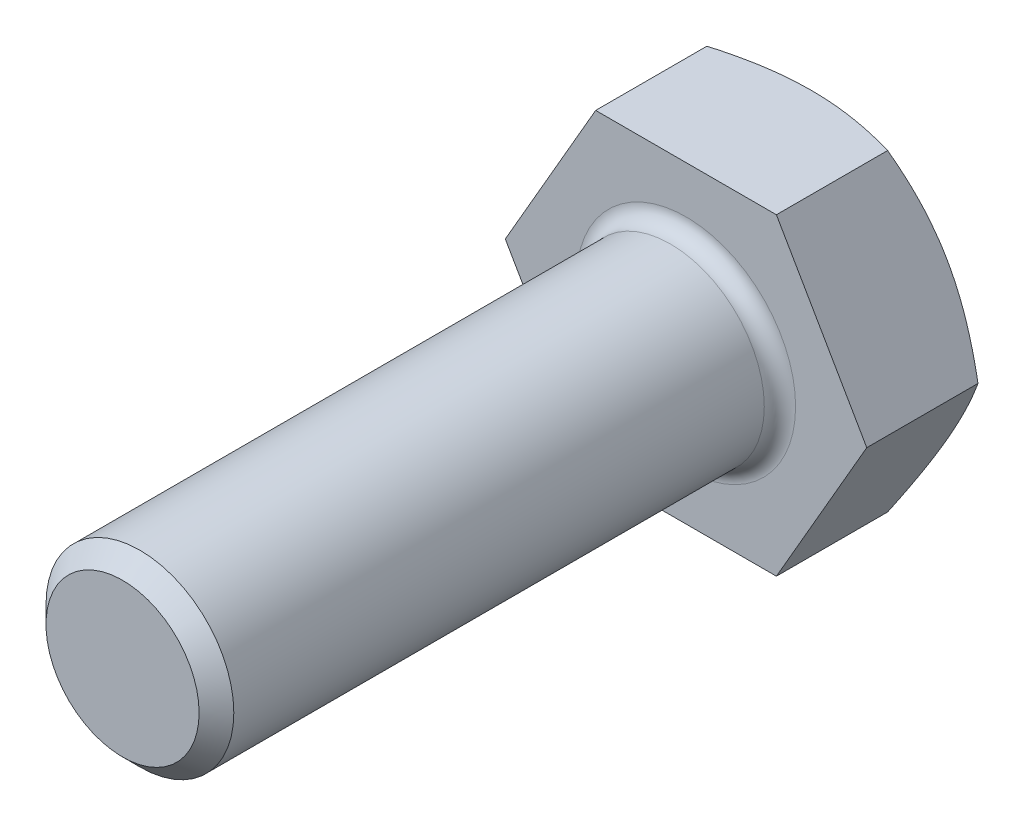
ISO-10303-21;
HEADER;
FILE_DESCRIPTION(('STEP AP214'),'2;1');
FILE_NAME('part.step','',(''),(''),'','','');
FILE_SCHEMA(('AUTOMOTIVE_DESIGN { 1 0 10303 214 1 1 1 1 }'));
ENDSEC;
DATA;
#1=APPLICATION_CONTEXT('core data for automotive mechanical design processes');
#2=APPLICATION_PROTOCOL_DEFINITION('international standard','automotive_design',2000,#1);
#3=PRODUCT_CONTEXT('',#1,'mechanical');
#4=PRODUCT('Part','Part','',(#3));
#5=PRODUCT_RELATED_PRODUCT_CATEGORY('part','',(#4));
#6=PRODUCT_DEFINITION_FORMATION('','',#4);
#7=PRODUCT_DEFINITION_CONTEXT('part definition',#1,'design');
#8=PRODUCT_DEFINITION('design','',#6,#7);
#9=PRODUCT_DEFINITION_SHAPE('','',#8);
#10=(LENGTH_UNIT() NAMED_UNIT(*) SI_UNIT(.MILLI.,.METRE.));
#11=(NAMED_UNIT(*) PLANE_ANGLE_UNIT() SI_UNIT($,.RADIAN.));
#12=(NAMED_UNIT(*) SI_UNIT($,.STERADIAN.) SOLID_ANGLE_UNIT());
#13=UNCERTAINTY_MEASURE_WITH_UNIT(LENGTH_MEASURE(1.E-05),#10,'distance_accuracy_value','');
#14=(GEOMETRIC_REPRESENTATION_CONTEXT(3) GLOBAL_UNCERTAINTY_ASSIGNED_CONTEXT((#13)) GLOBAL_UNIT_ASSIGNED_CONTEXT((#10,
#11,#12)) REPRESENTATION_CONTEXT('',''));
#15=CARTESIAN_POINT('',(0.,0.,0.));
#16=DIRECTION('',(0.,0.,1.));
#17=DIRECTION('',(1.,0.,0.));
#18=AXIS2_PLACEMENT_3D('',#15,#16,#17);
#19=CARTESIAN_POINT('',(2.88675134594813,5.,4.));
#20=DIRECTION('',(0.,-1.,0.));
#21=DIRECTION('',(0.,0.,-1.));
#22=AXIS2_PLACEMENT_3D('',#19,#20,#21);
#23=PLANE('',#22);
#24=CARTESIAN_POINT('',(-7.69351007373535,5.,2.41073539320998));
#25=CARTESIAN_POINT('',(-7.47563028132885,5.,2.30528952932301));
#26=CARTESIAN_POINT('',(-7.25724376185835,5.,2.20087243276268));
#27=CARTESIAN_POINT('',(-6.81918756106829,5.,1.99467562747014));
#28=CARTESIAN_POINT('',(-6.59951767848426,5.,1.89289634680442));
#29=CARTESIAN_POINT('',(-6.15746381474192,5.,1.69202990321084));
#30=CARTESIAN_POINT('',(-5.93507152691196,5.,1.59296095671938));
#31=CARTESIAN_POINT('',(-5.48849675031893,5.,1.39895918172899));
#32=CARTESIAN_POINT('',(-5.26431434858604,5.,1.30402615358498));
#33=CARTESIAN_POINT('',(-4.80680100250808,5.,1.11652060450691));
#34=CARTESIAN_POINT('',(-4.57340213157697,5.,1.02411290395836));
#35=CARTESIAN_POINT('',(-4.10385139143291,5.,0.846439364241654));
#36=CARTESIAN_POINT('',(-3.8676992134481,5.,0.761174335043388));
#37=CARTESIAN_POINT('',(-3.39272825877992,5.,0.600069100567776));
#38=CARTESIAN_POINT('',(-3.15391620483038,5.,0.524209277663956));
#39=CARTESIAN_POINT('',(-2.67286738091533,5.,0.384388671520273));
#40=CARTESIAN_POINT('',(-2.43063173524353,5.,0.320424075338103));
#41=CARTESIAN_POINT('',(-1.94393303667126,5.,0.207840571486141));
#42=CARTESIAN_POINT('',(-1.69948908057364,5.,0.1591406465361));
#43=CARTESIAN_POINT('',(-1.20762597667198,5.,0.079880200316764));
#44=CARTESIAN_POINT('',(-0.960207092736783,5.,0.0493180822020282));
#45=CARTESIAN_POINT('',(-0.466835356078061,5.,0.00917255112337458));
#46=CARTESIAN_POINT('',(-0.220904596602032,5.,-0.000675710583300175));
#47=CARTESIAN_POINT('',(0.270913653804565,5.,0.000747905110270291));
#48=CARTESIAN_POINT('',(0.516801143494729,5.,0.0120203124131996));
#49=CARTESIAN_POINT('',(0.936074320247447,5.,0.0484602236250781));
#50=CARTESIAN_POINT('',(1.10991455198277,5.,0.0686818064768634));
#51=CARTESIAN_POINT('',(1.45627462857565,5.,0.11838949287744));
#52=CARTESIAN_POINT('',(1.62879428287145,5.,0.147876908616344));
#53=CARTESIAN_POINT('',(2.14417000043277,5.,0.248682895098625));
#54=CARTESIAN_POINT('',(2.4846398501731,5.,0.332325270832714));
#55=CARTESIAN_POINT('',(2.99364573309528,5.,0.476750819518557));
#56=CARTESIAN_POINT('',(3.16483559894422,5.,0.528708451751169));
#57=CARTESIAN_POINT('',(3.50555141015082,5.,0.637867214480148));
#58=CARTESIAN_POINT('',(3.67507734485121,5.,0.695068378536384));
#59=CARTESIAN_POINT('',(4.01252192795271,5.,0.81380909369369));
#60=CARTESIAN_POINT('',(4.18044112064642,5.,0.875347111970002));
#61=CARTESIAN_POINT('',(4.51489875918392,5.,1.00205287980644));
#62=CARTESIAN_POINT('',(4.68143721823316,5.,1.0672205946058));
#63=CARTESIAN_POINT('',(5.06166990894508,5.,1.22002353242045));
#64=CARTESIAN_POINT('',(5.27495691175971,5.,1.30866996832444));
#65=CARTESIAN_POINT('',(5.699818623839,5.,1.48998572333166));
#66=CARTESIAN_POINT('',(5.91139324674905,5.,1.58265524383606));
#67=CARTESIAN_POINT('',(6.33312976606463,5.,1.77124300339131));
#68=CARTESIAN_POINT('',(6.54329141316975,5.,1.86716179859334));
#69=CARTESIAN_POINT('',(6.96239560175726,5.,2.06163045704118));
#70=CARTESIAN_POINT('',(7.17133812000263,5.,2.16018037023868));
#71=CARTESIAN_POINT('',(7.79699655556297,5.,2.45921586319786));
#72=CARTESIAN_POINT('',(8.2121735172791,5.,2.66291967722638));
#73=CARTESIAN_POINT('',(9.03958157499133,5.,3.07622363095274));
#74=CARTESIAN_POINT('',(9.45181257088041,5.,3.28582396983716));
#75=CARTESIAN_POINT('',(10.0523103242169,5.,3.59506118532461));
#76=CARTESIAN_POINT('',(10.241440264516,5.,3.69302677428426));
#77=CARTESIAN_POINT('',(10.6192877747391,5.,3.88974214840918));
#78=CARTESIAN_POINT('',(10.8080053517253,5.,3.98849192000835));
#79=CARTESIAN_POINT('',(11.3736352267194,5.,4.28576970222594));
#80=CARTESIAN_POINT('',(11.7500108106598,5.,4.48531902411275));
#81=CARTESIAN_POINT('',(12.5008000985828,5.,4.88605453323328));
#82=CARTESIAN_POINT('',(12.8752163111892,5.,5.08723602923357));
#83=CARTESIAN_POINT('',(13.62313349703,5.,5.4912493589846));
#84=CARTESIAN_POINT('',(13.9966345150779,5.,5.6940811097393));
#85=CARTESIAN_POINT('',(14.3697947956433,5.,5.89753391180807));
#86=B_SPLINE_CURVE_WITH_KNOTS('',3,(#24,#25,#26,#27,#28,#29,#30,#31,#32,#33,#34,#35,#36,#37,#38,
#39,#40,#41,#42,#43,#44,#45,#46,#47,#48,#49,#50,#51,#52,#53,#54,#55,#56,#57,#58,#59,#60,#61,#62,
#63,#64,#65,#66,#67,#68,#69,#70,#71,#72,#73,#74,#75,#76,#77,#78,#79,#80,#81,#82,#83,#84,#85),
.UNSPECIFIED.,.F.,.F.,(4,2,2,2,2,2,2,2,2,2,2,2,2,2,2,2,2,2,2,2,2,2,2,2,2,2,2,2,2,2,4),(0.,
0.726173004656775,1.45246312447192,2.18281075752483,2.9131230967877,3.66611176394432,
4.41918570379812,5.17066144719776,5.92189589286414,6.66907286412702,7.41618404445857,
8.15368304809099,8.89120055530086,9.41598194025131,9.94083767615656,10.9911582224908,
11.5278178132225,12.0644808389448,12.6009551277993,13.1374242798453,13.8302955547754,
14.523201555884,15.2162267611921,15.9092651329303,17.2965596278552,18.6839010424592,
19.3228882117649,19.961864350794,21.239863417747,22.514987960933,23.7900487660605),.UNSPECIFIED.);
#87=CARTESIAN_POINT('',(-2.88675134594813,5.,0.446581987385203));
#88=VERTEX_POINT('',#87);
#89=CARTESIAN_POINT('',(0.,5.,0.));
#90=VERTEX_POINT('',#89);
#91=EDGE_CURVE('E51',#88,#90,#86,.T.);
#92=ORIENTED_EDGE('',*,*,#91,.F.);
#93=DIRECTION('',(0.,0.,-1.));
#94=VECTOR('',#93,1.);
#95=CARTESIAN_POINT('',(-2.88675134594813,5.,4.));
#96=LINE('',#95,#94);
#97=CARTESIAN_POINT('',(-2.88675134594813,5.,4.));
#98=VERTEX_POINT('',#97);
#99=EDGE_CURVE('E150',#98,#88,#96,.T.);
#100=ORIENTED_EDGE('',*,*,#99,.F.);
#101=DIRECTION('',(-1.,0.,0.));
#102=VECTOR('',#101,1.);
#103=CARTESIAN_POINT('',(2.88675134594813,5.,4.));
#104=LINE('',#103,#102);
#105=CARTESIAN_POINT('',(2.88675134594813,5.,4.));
#106=VERTEX_POINT('',#105);
#107=EDGE_CURVE('E236',#106,#98,#104,.T.);
#108=ORIENTED_EDGE('',*,*,#107,.F.);
#109=DIRECTION('',(0.,0.,-1.));
#110=VECTOR('',#109,1.);
#111=CARTESIAN_POINT('',(2.88675134594813,5.,4.));
#112=LINE('',#111,#110);
#113=CARTESIAN_POINT('',(2.88675134594813,5.,0.446581987385203));
#114=VERTEX_POINT('',#113);
#115=EDGE_CURVE('E137',#106,#114,#112,.T.);
#116=ORIENTED_EDGE('',*,*,#115,.T.);
#117=EDGE_CURVE('E131',#90,#114,#86,.T.);
#118=ORIENTED_EDGE('',*,*,#117,.F.);
#119=EDGE_LOOP('',(#92,#100,#108,#116,#118));
#120=FACE_BOUND('',#119,.T.);
#121=ADVANCED_FACE('F36',(#120),#23,.F.);
#122=CARTESIAN_POINT('',(-2.88675134594813,5.,4.));
#123=DIRECTION('',(0.866025403784439,-0.5,0.));
#124=DIRECTION('',(0.5,0.866025403784439,0.));
#125=AXIS2_PLACEMENT_3D('',#122,#123,#124);
#126=PLANE('',#125);
#127=CARTESIAN_POINT('',(-5.77361816195008,-0.000199999999991873,0.446648656051846));
#128=CARTESIAN_POINT('',(-5.6467543346507,0.219534594525195,0.373386567637644));
#129=CARTESIAN_POINT('',(-5.51880543790589,0.441148584459592,0.306751321918097));
#130=CARTESIAN_POINT('',(-5.26069210252318,0.888213995453526,0.190438991010813));
#131=CARTESIAN_POINT('',(-5.13052307794721,1.11367335959079,0.140803049915792));
#132=CARTESIAN_POINT('',(-4.87177839004641,1.56183230522352,0.063551025418701));
#133=CARTESIAN_POINT('',(-4.74324302208386,1.7844620931042,0.035420378283492));
#134=CARTESIAN_POINT('',(-4.54998783160116,2.11918990184665,0.0101949219536872));
#135=CARTESIAN_POINT('',(-4.48552534905128,2.23084219680507,0.00461345976948678));
#136=CARTESIAN_POINT('',(-4.35654081066911,2.45424997067381,-0.000797783248526454));
#137=CARTESIAN_POINT('',(-4.29201875673849,2.56600544629032,-0.000627741741792921));
#138=CARTESIAN_POINT('',(-4.11524635305242,2.87218423085064,0.00775363179204099));
#139=CARTESIAN_POINT('',(-4.00305457769146,3.06650608596722,0.0218297718972562));
#140=CARTESIAN_POINT('',(-3.77941563226458,3.45386010199771,0.0664652571094361));
#141=CARTESIAN_POINT('',(-3.66796924828419,3.64689090137158,0.0970398601475138));
#142=CARTESIAN_POINT('',(-3.44387972423144,4.03502534247486,0.17346849362117));
#143=CARTESIAN_POINT('',(-3.3312648659868,4.23007999864174,0.219646378878686));
#144=CARTESIAN_POINT('',(-3.10771464157941,4.61728034535877,0.324451794491943));
#145=CARTESIAN_POINT('',(-2.99677641204848,4.80943099540809,0.383054703437385));
#146=CARTESIAN_POINT('',(-2.88663587589429,5.0002,0.446648656051846));
#147=B_SPLINE_CURVE_WITH_KNOTS('',3,(#127,#128,#129,#130,#131,#132,#133,#134,#135,#136,#137,
#138,#139,#140,#141,#142,#143,#144,#145,#146),.UNSPECIFIED.,.F.,.F.,(4,2,2,2,2,2,2,2,2,4),(0.,
0.792555841363091,1.58701660053333,2.3618153748728,2.74884076077325,3.13585419177295,
3.80962362599679,4.48401723901188,5.17336882348927,5.86136694793724),.UNSPECIFIED.);
#148=CARTESIAN_POINT('',(-5.77350269189626,0.,0.446581987385203));
#149=VERTEX_POINT('',#148);
#150=CARTESIAN_POINT('',(-4.33012701892219,2.5,0.));
#151=VERTEX_POINT('',#150);
#152=EDGE_CURVE('E59',#149,#151,#147,.T.);
#153=ORIENTED_EDGE('',*,*,#152,.F.);
#154=DIRECTION('',(0.,0.,-1.));
#155=VECTOR('',#154,1.);
#156=CARTESIAN_POINT('',(-5.77350269189626,0.,4.));
#157=LINE('',#156,#155);
#158=CARTESIAN_POINT('',(-5.77350269189626,0.,4.));
#159=VERTEX_POINT('',#158);
#160=EDGE_CURVE('E147',#159,#149,#157,.T.);
#161=ORIENTED_EDGE('',*,*,#160,.F.);
#162=DIRECTION('',(-0.5,-0.866025403784439,0.));
#163=VECTOR('',#162,1.);
#164=CARTESIAN_POINT('',(-2.88675134594813,5.,4.));
#165=LINE('',#164,#163);
#166=EDGE_CURVE('E283',#98,#159,#165,.T.);
#167=ORIENTED_EDGE('',*,*,#166,.F.);
#168=ORIENTED_EDGE('',*,*,#99,.T.);
#169=EDGE_CURVE('E225',#151,#88,#147,.T.);
#170=ORIENTED_EDGE('',*,*,#169,.F.);
#171=EDGE_LOOP('',(#153,#161,#167,#168,#170));
#172=FACE_BOUND('',#171,.T.);
#173=ADVANCED_FACE('F177',(#172),#126,.F.);
#174=CARTESIAN_POINT('',(-5.77350269189626,0.,4.));
#175=DIRECTION('',(0.866025403784439,0.5,0.));
#176=DIRECTION('',(-0.5,0.866025403784439,0.));
#177=AXIS2_PLACEMENT_3D('',#174,#175,#176);
#178=PLANE('',#177);
#179=CARTESIAN_POINT('',(-2.88663587589429,-5.0002,0.446648656051846));
#180=CARTESIAN_POINT('',(-3.01349970319368,-4.78046540547481,0.373386567637644));
#181=CARTESIAN_POINT('',(-3.14144859993849,-4.55885141554042,0.306751321918097));
#182=CARTESIAN_POINT('',(-3.39956193532121,-4.11178600454648,0.190438991010813));
#183=CARTESIAN_POINT('',(-3.52973095989718,-3.88632664040922,0.140803049915791));
#184=CARTESIAN_POINT('',(-3.78847564779798,-3.43816769477649,0.0635510254186999));
#185=CARTESIAN_POINT('',(-3.91701101576052,-3.2155379068958,0.0354203782834913));
#186=CARTESIAN_POINT('',(-4.11026620624323,-2.88081009815336,0.010194921953685));
#187=CARTESIAN_POINT('',(-4.17472868879311,-2.76915780319494,0.00461345976948377));
#188=CARTESIAN_POINT('',(-4.30371322717528,-2.5457500293262,-0.000797783248528615));
#189=CARTESIAN_POINT('',(-4.36823528110588,-2.43399455370968,-0.000627741741793385));
#190=CARTESIAN_POINT('',(-4.54500768479193,-2.12781576914935,0.0077536317920418));
#191=CARTESIAN_POINT('',(-4.65719946015292,-1.93349391403278,0.021829771897254));
#192=CARTESIAN_POINT('',(-4.88083840557982,-1.54613989800229,0.0664652571094318));
#193=CARTESIAN_POINT('',(-4.9922847895602,-1.35310909862843,0.0970398601475103));
#194=CARTESIAN_POINT('',(-5.21637431361295,-0.964974657525143,0.173468493621167));
#195=CARTESIAN_POINT('',(-5.32898917185759,-0.769920001358263,0.219646378878683));
#196=CARTESIAN_POINT('',(-5.55253939626498,-0.38271965464123,0.32445179449194));
#197=CARTESIAN_POINT('',(-5.66347762579591,-0.190569004591912,0.383054703437384));
#198=CARTESIAN_POINT('',(-5.77361816195008,0.000200000000005751,0.446648656051846));
#199=B_SPLINE_CURVE_WITH_KNOTS('',3,(#179,#180,#181,#182,#183,#184,#185,#186,#187,#188,#189,
#190,#191,#192,#193,#194,#195,#196,#197,#198),.UNSPECIFIED.,.F.,.F.,(4,2,2,2,2,2,2,2,2,4),(0.,
0.792555841363093,1.58701660053334,2.36181537487281,2.74884076077326,3.13585419177295,
3.80962362599679,4.48401723901189,5.17336882348929,5.86136694793725),.UNSPECIFIED.);
#200=CARTESIAN_POINT('',(-2.88675134594813,-5.,0.446581987385203));
#201=VERTEX_POINT('',#200);
#202=CARTESIAN_POINT('',(-4.33012701892219,-2.5,0.));
#203=VERTEX_POINT('',#202);
#204=EDGE_CURVE('E234',#201,#203,#199,.T.);
#205=ORIENTED_EDGE('',*,*,#204,.F.);
#206=DIRECTION('',(0.,0.,-1.));
#207=VECTOR('',#206,1.);
#208=CARTESIAN_POINT('',(-2.88675134594813,-5.,4.));
#209=LINE('',#208,#207);
#210=CARTESIAN_POINT('',(-2.88675134594813,-5.,4.));
#211=VERTEX_POINT('',#210);
#212=EDGE_CURVE('E139',#211,#201,#209,.T.);
#213=ORIENTED_EDGE('',*,*,#212,.F.);
#214=DIRECTION('',(0.5,-0.866025403784439,0.));
#215=VECTOR('',#214,1.);
#216=CARTESIAN_POINT('',(-5.77350269189626,0.,4.));
#217=LINE('',#216,#215);
#218=EDGE_CURVE('E284',#159,#211,#217,.T.);
#219=ORIENTED_EDGE('',*,*,#218,.F.);
#220=ORIENTED_EDGE('',*,*,#160,.T.);
#221=EDGE_CURVE('E229',#203,#149,#199,.T.);
#222=ORIENTED_EDGE('',*,*,#221,.F.);
#223=EDGE_LOOP('',(#205,#213,#219,#220,#222));
#224=FACE_BOUND('',#223,.T.);
#225=ADVANCED_FACE('F183',(#224),#178,.F.);
#226=CARTESIAN_POINT('',(-2.88675134594813,-5.,4.));
#227=DIRECTION('',(0.,1.,0.));
#228=DIRECTION('',(0.,0.,1.));
#229=AXIS2_PLACEMENT_3D('',#226,#227,#228);
#230=PLANE('',#229);
#231=CARTESIAN_POINT('',(-7.69351007373535,-4.99999999999999,2.41073539320998));
#232=CARTESIAN_POINT('',(-7.47563028132885,-5.,2.30528952932301));
#233=CARTESIAN_POINT('',(-7.25724376185835,-5.,2.20087243276268));
#234=CARTESIAN_POINT('',(-6.81918756106829,-5.00000000000001,1.99467562747014));
#235=CARTESIAN_POINT('',(-6.59951767848426,-5.,1.89289634680442));
#236=CARTESIAN_POINT('',(-6.15746381474192,-5.,1.69202990321084));
#237=CARTESIAN_POINT('',(-5.93507152691195,-5.,1.59296095671937));
#238=CARTESIAN_POINT('',(-5.48849675031893,-5.,1.39895918172898));
#239=CARTESIAN_POINT('',(-5.26431434858603,-5.,1.30402615358498));
#240=CARTESIAN_POINT('',(-4.80680100250807,-5.,1.11652060450691));
#241=CARTESIAN_POINT('',(-4.57340213157696,-5.,1.02411290395835));
#242=CARTESIAN_POINT('',(-4.1038513914329,-5.,0.846439364241651));
#243=CARTESIAN_POINT('',(-3.8676992134481,-5.,0.761174335043385));
#244=CARTESIAN_POINT('',(-3.39272825877992,-5.,0.600069100567773));
#245=CARTESIAN_POINT('',(-3.15391620483038,-5.,0.524209277663952));
#246=CARTESIAN_POINT('',(-2.67286738091532,-5.,0.38438867152027));
#247=CARTESIAN_POINT('',(-2.43063173524352,-5.,0.320424075338103));
#248=CARTESIAN_POINT('',(-1.94393303667124,-5.,0.207840571486142));
#249=CARTESIAN_POINT('',(-1.69948908057363,-5.,0.159140646536099));
#250=CARTESIAN_POINT('',(-1.20762597667198,-5.,0.0798802003167623));
#251=CARTESIAN_POINT('',(-0.960207092736779,-5.,0.0493180822020273));
#252=CARTESIAN_POINT('',(-0.466835356078061,-5.,0.00917255112337445));
#253=CARTESIAN_POINT('',(-0.220904596602033,-5.,-0.000675710583300293));
#254=CARTESIAN_POINT('',(0.270913653804561,-5.,0.000747905110270507));
#255=CARTESIAN_POINT('',(0.516801143494723,-5.,0.0120203124132002));
#256=CARTESIAN_POINT('',(0.936074320247442,-5.,0.0484602236250778));
#257=CARTESIAN_POINT('',(1.10991455198276,-5.,0.0686818064768624));
#258=CARTESIAN_POINT('',(1.45627462857564,-5.,0.118389492877439));
#259=CARTESIAN_POINT('',(1.62879428287144,-5.,0.147876908616344));
#260=CARTESIAN_POINT('',(2.14417000043277,-5.,0.248682895098625));
#261=CARTESIAN_POINT('',(2.4846398501731,-5.,0.332325270832713));
#262=CARTESIAN_POINT('',(2.99364573309527,-5.,0.476750819518556));
#263=CARTESIAN_POINT('',(3.16483559894422,-5.,0.528708451751168));
#264=CARTESIAN_POINT('',(3.50555141015081,-5.,0.637867214480147));
#265=CARTESIAN_POINT('',(3.67507734485121,-5.,0.695068378536382));
#266=CARTESIAN_POINT('',(4.01252192795271,-5.,0.813809093693689));
#267=CARTESIAN_POINT('',(4.18044112064641,-5.,0.875347111970001));
#268=CARTESIAN_POINT('',(4.51489875918392,-5.,1.00205287980644));
#269=CARTESIAN_POINT('',(4.68143721823316,-5.,1.0672205946058));
#270=CARTESIAN_POINT('',(5.06166990894508,-5.,1.22002353242045));
#271=CARTESIAN_POINT('',(5.27495691175971,-5.,1.30866996832444));
#272=CARTESIAN_POINT('',(5.699818623839,-5.,1.48998572333166));
#273=CARTESIAN_POINT('',(5.91139324674905,-5.,1.58265524383606));
#274=CARTESIAN_POINT('',(6.33312976606464,-5.,1.77124300339131));
#275=CARTESIAN_POINT('',(6.54329141316975,-5.,1.86716179859334));
#276=CARTESIAN_POINT('',(6.96239560175726,-5.,2.06163045704118));
#277=CARTESIAN_POINT('',(7.17133812000263,-5.,2.16018037023868));
#278=CARTESIAN_POINT('',(7.79699655556297,-5.,2.45921586319786));
#279=CARTESIAN_POINT('',(8.2121735172791,-5.,2.66291967722638));
#280=CARTESIAN_POINT('',(9.03958157499133,-5.,3.07622363095274));
#281=CARTESIAN_POINT('',(9.45181257088042,-5.,3.28582396983716));
#282=CARTESIAN_POINT('',(10.0523103242169,-5.,3.59506118532461));
#283=CARTESIAN_POINT('',(10.241440264516,-5.,3.69302677428426));
#284=CARTESIAN_POINT('',(10.6192877747391,-5.,3.88974214840918));
#285=CARTESIAN_POINT('',(10.8080053517253,-5.,3.98849192000835));
#286=CARTESIAN_POINT('',(11.3736352267194,-5.,4.28576970222594));
#287=CARTESIAN_POINT('',(11.7500108106598,-5.,4.48531902411275));
#288=CARTESIAN_POINT('',(12.5008000985828,-5.,4.88605453323329));
#289=CARTESIAN_POINT('',(12.8752163111892,-5.,5.08723602923357));
#290=CARTESIAN_POINT('',(13.62313349703,-5.,5.4912493589846));
#291=CARTESIAN_POINT('',(13.9966345150779,-5.,5.6940811097393));
#292=CARTESIAN_POINT('',(14.3697947956433,-5.,5.89753391180807));
#293=B_SPLINE_CURVE_WITH_KNOTS('',3,(#231,#232,#233,#234,#235,#236,#237,#238,#239,#240,#241,
#242,#243,#244,#245,#246,#247,#248,#249,#250,#251,#252,#253,#254,#255,#256,#257,#258,#259,#260,
#261,#262,#263,#264,#265,#266,#267,#268,#269,#270,#271,#272,#273,#274,#275,#276,#277,#278,#279,
#280,#281,#282,#283,#284,#285,#286,#287,#288,#289,#290,#291,#292),.UNSPECIFIED.,.F.,.F.,(4,2,2,
2,2,2,2,2,2,2,2,2,2,2,2,2,2,2,2,2,2,2,2,2,2,2,2,2,2,2,4),(0.,0.726173004656776,1.45246312447192,
2.18281075752484,2.9131230967877,3.66611176394433,4.41918570379813,5.17066144719776,
5.92189589286416,6.66907286412703,7.41618404445857,8.15368304809099,8.89120055530085,
9.41598194025131,9.94083767615655,10.9911582224908,11.5278178132225,12.0644808389448,
12.6009551277993,13.1374242798453,13.8302955547754,14.523201555884,15.2162267611921,
15.9092651329303,17.2965596278552,18.6839010424592,19.3228882117649,19.961864350794,
21.239863417747,22.514987960933,23.7900487660605),.UNSPECIFIED.);
#294=CARTESIAN_POINT('',(2.88675134594813,-5.,0.446581987385203));
#295=VERTEX_POINT('',#294);
#296=CARTESIAN_POINT('',(0.,-5.,0.));
#297=VERTEX_POINT('',#296);
#298=EDGE_CURVE('E199',#295,#297,#293,.F.);
#299=ORIENTED_EDGE('',*,*,#298,.F.);
#300=DIRECTION('',(0.,0.,-1.));
#301=VECTOR('',#300,1.);
#302=CARTESIAN_POINT('',(2.88675134594813,-5.,4.));
#303=LINE('',#302,#301);
#304=CARTESIAN_POINT('',(2.88675134594813,-5.,4.));
#305=VERTEX_POINT('',#304);
#306=EDGE_CURVE('E136',#305,#295,#303,.T.);
#307=ORIENTED_EDGE('',*,*,#306,.F.);
#308=DIRECTION('',(1.,0.,0.));
#309=VECTOR('',#308,1.);
#310=CARTESIAN_POINT('',(-2.88675134594813,-5.,4.));
#311=LINE('',#310,#309);
#312=EDGE_CURVE('E302',#211,#305,#311,.T.);
#313=ORIENTED_EDGE('',*,*,#312,.F.);
#314=ORIENTED_EDGE('',*,*,#212,.T.);
#315=EDGE_CURVE('E235',#297,#201,#293,.F.);
#316=ORIENTED_EDGE('',*,*,#315,.F.);
#317=EDGE_LOOP('',(#299,#307,#313,#314,#316));
#318=FACE_BOUND('',#317,.T.);
#319=ADVANCED_FACE('F240',(#318),#230,.F.);
#320=CARTESIAN_POINT('',(2.88675134594813,-5.,4.));
#321=DIRECTION('',(-0.866025403784439,0.5,0.));
#322=DIRECTION('',(-0.5,-0.866025403784439,0.));
#323=AXIS2_PLACEMENT_3D('',#320,#321,#322);
#324=PLANE('',#323);
#325=CARTESIAN_POINT('',(5.77361816195009,0.000200000000005751,0.446648656051846));
#326=CARTESIAN_POINT('',(5.64675433465071,-0.219534594525181,0.373386567637646));
#327=CARTESIAN_POINT('',(5.5188054379059,-0.441148584459578,0.3067513219181));
#328=CARTESIAN_POINT('',(5.26069210252318,-0.888213995453512,0.190438991010815));
#329=CARTESIAN_POINT('',(5.13052307794721,-1.11367335959077,0.140803049915793));
#330=CARTESIAN_POINT('',(4.87177839004641,-1.56183230522351,0.0635510254187014));
#331=CARTESIAN_POINT('',(4.74324302208387,-1.78446209310419,0.0354203782834925));
#332=CARTESIAN_POINT('',(4.54998783160116,-2.11918990184664,0.0101949219536871));
#333=CARTESIAN_POINT('',(4.48552534905128,-2.23084219680506,0.00461345976948642));
#334=CARTESIAN_POINT('',(4.35654081066911,-2.4542499706738,-0.000797783248526783));
#335=CARTESIAN_POINT('',(4.2920187567385,-2.56600544629032,-0.000627741741792961));
#336=CARTESIAN_POINT('',(4.11524635305244,-2.87218423085064,0.00775363179204107));
#337=CARTESIAN_POINT('',(4.00305457769146,-3.06650608596722,0.0218297718972556));
#338=CARTESIAN_POINT('',(3.77941563226458,-3.45386010199771,0.0664652571094349));
#339=CARTESIAN_POINT('',(3.66796924828419,-3.64689090137157,0.0970398601475127));
#340=CARTESIAN_POINT('',(3.44387972423144,-4.03502534247486,0.173468493621169));
#341=CARTESIAN_POINT('',(3.3312648659868,-4.23007999864174,0.219646378878685));
#342=CARTESIAN_POINT('',(3.10771464157941,-4.61728034535877,0.324451794491942));
#343=CARTESIAN_POINT('',(2.99677641204847,-4.80943099540809,0.383054703437385));
#344=CARTESIAN_POINT('',(2.88663587589429,-5.0002,0.446648656051846));
#345=B_SPLINE_CURVE_WITH_KNOTS('',3,(#325,#326,#327,#328,#329,#330,#331,#332,#333,#334,#335,
#336,#337,#338,#339,#340,#341,#342,#343,#344),.UNSPECIFIED.,.F.,.F.,(4,2,2,2,2,2,2,2,2,4),(0.,
0.792555841363093,1.58701660053334,2.36181537487281,2.74884076077326,3.13585419177296,
3.8096236259968,4.4840172390119,5.17336882348929,5.86136694793726),.UNSPECIFIED.);
#346=CARTESIAN_POINT('',(5.77350269189626,0.,0.446581987385203));
#347=VERTEX_POINT('',#346);
#348=CARTESIAN_POINT('',(4.33012701892219,-2.5,0.));
#349=VERTEX_POINT('',#348);
#350=EDGE_CURVE('E112',#347,#349,#345,.T.);
#351=ORIENTED_EDGE('',*,*,#350,.F.);
#352=DIRECTION('',(0.,0.,-1.));
#353=VECTOR('',#352,1.);
#354=CARTESIAN_POINT('',(5.77350269189626,0.,4.));
#355=LINE('',#354,#353);
#356=CARTESIAN_POINT('',(5.77350269189626,0.,4.));
#357=VERTEX_POINT('',#356);
#358=EDGE_CURVE('E127',#357,#347,#355,.T.);
#359=ORIENTED_EDGE('',*,*,#358,.F.);
#360=DIRECTION('',(0.5,0.866025403784439,0.));
#361=VECTOR('',#360,1.);
#362=CARTESIAN_POINT('',(2.88675134594813,-5.,4.));
#363=LINE('',#362,#361);
#364=EDGE_CURVE('E301',#305,#357,#363,.T.);
#365=ORIENTED_EDGE('',*,*,#364,.F.);
#366=ORIENTED_EDGE('',*,*,#306,.T.);
#367=EDGE_CURVE('E130',#349,#295,#345,.T.);
#368=ORIENTED_EDGE('',*,*,#367,.F.);
#369=EDGE_LOOP('',(#351,#359,#365,#366,#368));
#370=FACE_BOUND('',#369,.T.);
#371=ADVANCED_FACE('F125',(#370),#324,.F.);
#372=CARTESIAN_POINT('',(5.77350269189626,0.,4.));
#373=DIRECTION('',(-0.866025403784439,-0.5,0.));
#374=DIRECTION('',(0.5,-0.866025403784439,0.));
#375=AXIS2_PLACEMENT_3D('',#372,#373,#374);
#376=PLANE('',#375);
#377=CARTESIAN_POINT('',(2.88663587589429,5.0002,0.446648656051846));
#378=CARTESIAN_POINT('',(3.01349970319368,4.78046540547481,0.373386567637644));
#379=CARTESIAN_POINT('',(3.14144859993849,4.55885141554042,0.306751321918097));
#380=CARTESIAN_POINT('',(3.39956193532121,4.11178600454648,0.190438991010812));
#381=CARTESIAN_POINT('',(3.52973095989718,3.88632664040922,0.14080304991579));
#382=CARTESIAN_POINT('',(3.78847564779798,3.43816769477648,0.0635510254186982));
#383=CARTESIAN_POINT('',(3.91701101576052,3.2155379068958,0.0354203782834892));
#384=CARTESIAN_POINT('',(4.11026620624323,2.88081009815335,0.0101949219536836));
#385=CARTESIAN_POINT('',(4.17472868879311,2.76915780319493,0.00461345976948273));
#386=CARTESIAN_POINT('',(4.30371322717528,2.54575002932619,-0.000797783248529011));
#387=CARTESIAN_POINT('',(4.3682352811059,2.43399455370968,-0.000627741741793535));
#388=CARTESIAN_POINT('',(4.54500768479195,2.12781576914935,0.00775363179204201));
#389=CARTESIAN_POINT('',(4.65719946015293,1.93349391403278,0.0218297718972541));
#390=CARTESIAN_POINT('',(4.88083840557981,1.54613989800229,0.0664652571094317));
#391=CARTESIAN_POINT('',(4.9922847895602,1.35310909862842,0.0970398601475102));
#392=CARTESIAN_POINT('',(5.21637431361295,0.964974657525143,0.173468493621167));
#393=CARTESIAN_POINT('',(5.32898917185759,0.769920001358262,0.219646378878682));
#394=CARTESIAN_POINT('',(5.55253939626498,0.382719654641233,0.324451794491939));
#395=CARTESIAN_POINT('',(5.66347762579591,0.190569004591917,0.383054703437383));
#396=CARTESIAN_POINT('',(5.77361816195009,-0.000199999999991873,0.446648656051846));
#397=B_SPLINE_CURVE_WITH_KNOTS('',3,(#377,#378,#379,#380,#381,#382,#383,#384,#385,#386,#387,
#388,#389,#390,#391,#392,#393,#394,#395,#396),.UNSPECIFIED.,.F.,.F.,(4,2,2,2,2,2,2,2,2,4),(0.,
0.792555841363095,1.58701660053334,2.36181537487282,2.74884076077326,3.13585419177296,
3.8096236259968,4.4840172390119,5.17336882348928,5.86136694793725),.UNSPECIFIED.);
#398=CARTESIAN_POINT('',(4.33012701892219,2.5,0.));
#399=VERTEX_POINT('',#398);
#400=EDGE_CURVE('E119',#114,#399,#397,.T.);
#401=ORIENTED_EDGE('',*,*,#400,.F.);
#402=ORIENTED_EDGE('',*,*,#115,.F.);
#403=DIRECTION('',(-0.5,0.866025403784439,0.));
#404=VECTOR('',#403,1.);
#405=CARTESIAN_POINT('',(5.77350269189626,0.,4.));
#406=LINE('',#405,#404);
#407=EDGE_CURVE('E135',#357,#106,#406,.T.);
#408=ORIENTED_EDGE('',*,*,#407,.F.);
#409=ORIENTED_EDGE('',*,*,#358,.T.);
#410=EDGE_CURVE('E109',#399,#347,#397,.T.);
#411=ORIENTED_EDGE('',*,*,#410,.F.);
#412=EDGE_LOOP('',(#401,#402,#408,#409,#411));
#413=FACE_BOUND('',#412,.T.);
#414=ADVANCED_FACE('F133',(#413),#376,.F.);
#415=CARTESIAN_POINT('',(0.,0.,4.));
#416=DIRECTION('',(0.,0.,1.));
#417=DIRECTION('',(1.,0.,0.));
#418=AXIS2_PLACEMENT_3D('',#415,#416,#417);
#419=PLANE('',#418);
#420=CARTESIAN_POINT('',(0.,0.,4.));
#421=DIRECTION('',(0.,0.,1.));
#422=DIRECTION('',(1.,0.,0.));
#423=AXIS2_PLACEMENT_3D('',#420,#421,#422);
#424=CIRCLE('',#423,3.5);
#425=CARTESIAN_POINT('',(3.5,0.,4.));
#426=VERTEX_POINT('',#425);
#427=EDGE_CURVE('E11',#426,#426,#424,.F.);
#428=ORIENTED_EDGE('',*,*,#427,.T.);
#429=EDGE_LOOP('',(#428));
#430=FACE_BOUND('',#429,.T.);
#431=ORIENTED_EDGE('',*,*,#107,.T.);
#432=ORIENTED_EDGE('',*,*,#166,.T.);
#433=ORIENTED_EDGE('',*,*,#218,.T.);
#434=ORIENTED_EDGE('',*,*,#312,.T.);
#435=ORIENTED_EDGE('',*,*,#364,.T.);
#436=ORIENTED_EDGE('',*,*,#407,.T.);
#437=EDGE_LOOP('',(#431,#432,#433,#434,#435,#436));
#438=FACE_BOUND('',#437,.T.);
#439=ADVANCED_FACE('F250',(#430,#438),#419,.T.);
#440=CARTESIAN_POINT('',(0.,0.,22.));
#441=DIRECTION('',(0.,0.,-1.));
#442=DIRECTION('',(-1.,0.,0.));
#443=AXIS2_PLACEMENT_3D('',#440,#441,#442);
#444=CYLINDRICAL_SURFACE('',#443,3.);
#445=CARTESIAN_POINT('',(0.,0.,4.5));
#446=DIRECTION('',(0.,0.,1.));
#447=DIRECTION('',(1.,0.,0.));
#448=AXIS2_PLACEMENT_3D('',#445,#446,#447);
#449=CIRCLE('',#448,3.);
#450=CARTESIAN_POINT('',(3.,0.,4.5));
#451=VERTEX_POINT('',#450);
#452=EDGE_CURVE('E44',#451,#451,#449,.T.);
#453=ORIENTED_EDGE('',*,*,#452,.T.);
#454=EDGE_LOOP('',(#453));
#455=FACE_BOUND('',#454,.T.);
#456=CARTESIAN_POINT('',(0.,0.,21.4455));
#457=DIRECTION('',(0.,0.,1.));
#458=DIRECTION('',(1.,0.,0.));
#459=AXIS2_PLACEMENT_3D('',#456,#457,#458);
#460=CIRCLE('',#459,3.);
#461=CARTESIAN_POINT('',(3.,0.,21.4455));
#462=VERTEX_POINT('',#461);
#463=EDGE_CURVE('E159',#462,#462,#460,.F.);
#464=ORIENTED_EDGE('',*,*,#463,.T.);
#465=EDGE_LOOP('',(#464));
#466=FACE_BOUND('',#465,.T.);
#467=ADVANCED_FACE('F164',(#455,#466),#444,.T.);
#468=CARTESIAN_POINT('',(0.,0.,22.));
#469=DIRECTION('',(0.,0.,1.));
#470=DIRECTION('',(1.,0.,0.));
#471=AXIS2_PLACEMENT_3D('',#468,#469,#470);
#472=PLANE('',#471);
#473=CARTESIAN_POINT('',(0.,0.,22.));
#474=DIRECTION('',(0.,0.,1.));
#475=DIRECTION('',(1.,0.,0.));
#476=AXIS2_PLACEMENT_3D('',#473,#474,#475);
#477=CIRCLE('',#476,2.4455);
#478=CARTESIAN_POINT('',(2.4455,0.,22.));
#479=VERTEX_POINT('',#478);
#480=EDGE_CURVE('E156',#479,#479,#477,.T.);
#481=ORIENTED_EDGE('',*,*,#480,.T.);
#482=EDGE_LOOP('',(#481));
#483=FACE_BOUND('',#482,.T.);
#484=ADVANCED_FACE('F212',(#483),#472,.T.);
#485=CARTESIAN_POINT('',(0.,0.,0.715914333795142));
#486=DIRECTION('',(0.,0.,1.));
#487=DIRECTION('',(1.,0.,0.));
#488=AXIS2_PLACEMENT_3D('',#485,#486,#487);
#489=CONICAL_SURFACE('',#488,6.24,1.04719755119659);
#490=ORIENTED_EDGE('',*,*,#350,.T.);
#491=CARTESIAN_POINT('',(0.,0.,0.));
#492=DIRECTION('',(0.,0.,1.));
#493=DIRECTION('',(1.,0.,0.));
#494=AXIS2_PLACEMENT_3D('',#491,#492,#493);
#495=CIRCLE('',#494,5.);
#496=EDGE_CURVE('E114',#349,#399,#495,.T.);
#497=ORIENTED_EDGE('',*,*,#496,.T.);
#498=ORIENTED_EDGE('',*,*,#410,.T.);
#499=EDGE_LOOP('',(#490,#497,#498));
#500=FACE_BOUND('',#499,.T.);
#501=ADVANCED_FACE('F111',(#500),#489,.T.);
#502=ORIENTED_EDGE('',*,*,#298,.T.);
#503=EDGE_CURVE('E154',#297,#349,#495,.T.);
#504=ORIENTED_EDGE('',*,*,#503,.T.);
#505=ORIENTED_EDGE('',*,*,#367,.T.);
#506=EDGE_LOOP('',(#502,#504,#505));
#507=FACE_BOUND('',#506,.T.);
#508=ADVANCED_FACE('F210',(#507),#489,.T.);
#509=ORIENTED_EDGE('',*,*,#204,.T.);
#510=EDGE_CURVE('E288',#203,#297,#495,.T.);
#511=ORIENTED_EDGE('',*,*,#510,.T.);
#512=ORIENTED_EDGE('',*,*,#315,.T.);
#513=EDGE_LOOP('',(#509,#511,#512));
#514=FACE_BOUND('',#513,.T.);
#515=ADVANCED_FACE('F205',(#514),#489,.T.);
#516=ORIENTED_EDGE('',*,*,#221,.T.);
#517=ORIENTED_EDGE('',*,*,#152,.T.);
#518=EDGE_CURVE('E294',#151,#203,#495,.T.);
#519=ORIENTED_EDGE('',*,*,#518,.T.);
#520=EDGE_LOOP('',(#516,#517,#519));
#521=FACE_BOUND('',#520,.T.);
#522=ADVANCED_FACE('F209',(#521),#489,.T.);
#523=ORIENTED_EDGE('',*,*,#169,.T.);
#524=ORIENTED_EDGE('',*,*,#91,.T.);
#525=EDGE_CURVE('E155',#90,#151,#495,.T.);
#526=ORIENTED_EDGE('',*,*,#525,.T.);
#527=EDGE_LOOP('',(#523,#524,#526));
#528=FACE_BOUND('',#527,.T.);
#529=ADVANCED_FACE('F271',(#528),#489,.T.);
#530=ORIENTED_EDGE('',*,*,#117,.T.);
#531=ORIENTED_EDGE('',*,*,#400,.T.);
#532=CARTESIAN_POINT('',(0.,0.,0.));
#533=DIRECTION('',(0.,0.,1.));
#534=DIRECTION('',(1.,0.,0.));
#535=AXIS2_PLACEMENT_3D('',#532,#533,#534);
#536=CIRCLE('',#535,5.);
#537=EDGE_CURVE('E120',#399,#90,#536,.T.);
#538=ORIENTED_EDGE('',*,*,#537,.T.);
#539=EDGE_LOOP('',(#530,#531,#538));
#540=FACE_BOUND('',#539,.T.);
#541=ADVANCED_FACE('F253',(#540),#489,.T.);
#542=CARTESIAN_POINT('',(0.,0.,0.));
#543=DIRECTION('',(0.,0.,1.));
#544=DIRECTION('',(1.,0.,0.));
#545=AXIS2_PLACEMENT_3D('',#542,#543,#544);
#546=PLANE('',#545);
#547=ORIENTED_EDGE('',*,*,#537,.F.);
#548=ORIENTED_EDGE('',*,*,#496,.F.);
#549=ORIENTED_EDGE('',*,*,#503,.F.);
#550=ORIENTED_EDGE('',*,*,#510,.F.);
#551=ORIENTED_EDGE('',*,*,#518,.F.);
#552=ORIENTED_EDGE('',*,*,#525,.F.);
#553=EDGE_LOOP('',(#547,#548,#549,#550,#551,#552));
#554=FACE_BOUND('',#553,.T.);
#555=ADVANCED_FACE('F173',(#554),#546,.F.);
#556=CARTESIAN_POINT('',(0.,0.,22.));
#557=DIRECTION('',(0.,0.,-1.));
#558=DIRECTION('',(-1.,0.,0.));
#559=AXIS2_PLACEMENT_3D('',#556,#557,#558);
#560=CONICAL_SURFACE('',#559,2.4455,0.785398163397446);
#561=ORIENTED_EDGE('',*,*,#463,.F.);
#562=EDGE_LOOP('',(#561));
#563=FACE_BOUND('',#562,.T.);
#564=ORIENTED_EDGE('',*,*,#480,.F.);
#565=EDGE_LOOP('',(#564));
#566=FACE_BOUND('',#565,.T.);
#567=ADVANCED_FACE('F168',(#563,#566),#560,.T.);
#568=CARTESIAN_POINT('',(0.,0.,4.5));
#569=DIRECTION('',(0.,0.,1.));
#570=DIRECTION('',(1.,0.,0.));
#571=AXIS2_PLACEMENT_3D('',#568,#569,#570);
#572=TOROIDAL_SURFACE('',#571,3.5,0.5);
#573=ORIENTED_EDGE('',*,*,#427,.F.);
#574=EDGE_LOOP('',(#573));
#575=FACE_BOUND('',#574,.T.);
#576=ORIENTED_EDGE('',*,*,#452,.F.);
#577=EDGE_LOOP('',(#576));
#578=FACE_BOUND('',#577,.T.);
#579=ADVANCED_FACE('F38',(#575,#578),#572,.F.);
#580=CLOSED_SHELL('',(#121,#173,#225,#319,#371,#414,#439,#467,#484,#501,#508,#515,#522,#529,
#541,#555,#567,#579));
#581=MANIFOLD_SOLID_BREP('B2',#580);
#582=ADVANCED_BREP_SHAPE_REPRESENTATION('',(#18,#581),#14);
#583=SHAPE_DEFINITION_REPRESENTATION(#9,#582);
ENDSEC;
END-ISO-10303-21;
